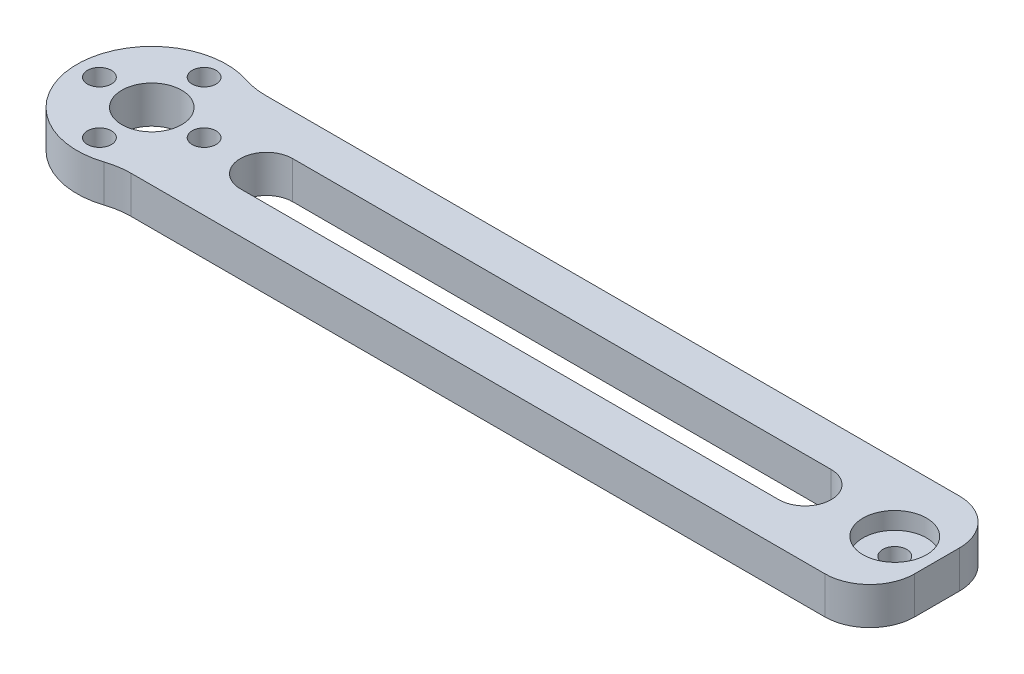
ISO-10303-21;
HEADER;
FILE_DESCRIPTION(('STEP AP214'),'2;1');
FILE_NAME('part.step','',(''),(''),'','','');
FILE_SCHEMA(('AUTOMOTIVE_DESIGN { 1 0 10303 214 1 1 1 1 }'));
ENDSEC;
DATA;
#1=APPLICATION_CONTEXT('core data for automotive mechanical design processes');
#2=APPLICATION_PROTOCOL_DEFINITION('international standard','automotive_design',2000,#1);
#3=PRODUCT_CONTEXT('',#1,'mechanical');
#4=PRODUCT('Part','Part','',(#3));
#5=PRODUCT_RELATED_PRODUCT_CATEGORY('part','',(#4));
#6=PRODUCT_DEFINITION_FORMATION('','',#4);
#7=PRODUCT_DEFINITION_CONTEXT('part definition',#1,'design');
#8=PRODUCT_DEFINITION('design','',#6,#7);
#9=PRODUCT_DEFINITION_SHAPE('','',#8);
#10=(LENGTH_UNIT() NAMED_UNIT(*) SI_UNIT(.MILLI.,.METRE.));
#11=(NAMED_UNIT(*) PLANE_ANGLE_UNIT() SI_UNIT($,.RADIAN.));
#12=(NAMED_UNIT(*) SI_UNIT($,.STERADIAN.) SOLID_ANGLE_UNIT());
#13=UNCERTAINTY_MEASURE_WITH_UNIT(LENGTH_MEASURE(1.E-05),#10,'distance_accuracy_value','');
#14=(GEOMETRIC_REPRESENTATION_CONTEXT(3) GLOBAL_UNCERTAINTY_ASSIGNED_CONTEXT((#13)) GLOBAL_UNIT_ASSIGNED_CONTEXT((#10,
#11,#12)) REPRESENTATION_CONTEXT('',''));
#15=CARTESIAN_POINT('',(0.,0.,0.));
#16=DIRECTION('',(0.,0.,1.));
#17=DIRECTION('',(1.,0.,0.));
#18=AXIS2_PLACEMENT_3D('',#15,#16,#17);
#19=CARTESIAN_POINT('',(99.34,5.,0.));
#20=DIRECTION('',(0.,-1.,0.));
#21=DIRECTION('',(0.,0.,-1.));
#22=AXIS2_PLACEMENT_3D('',#19,#20,#21);
#23=CYLINDRICAL_SURFACE('',#22,1.60000000000001);
#24=CARTESIAN_POINT('',(99.34,0.,0.));
#25=DIRECTION('',(0.,1.,0.));
#26=DIRECTION('',(0.,0.,1.));
#27=AXIS2_PLACEMENT_3D('',#24,#25,#26);
#28=CIRCLE('',#27,1.60000000000001);
#29=CARTESIAN_POINT('',(99.34,0.,1.6));
#30=VERTEX_POINT('',#29);
#31=EDGE_CURVE('E220',#30,#30,#28,.T.);
#32=ORIENTED_EDGE('',*,*,#31,.F.);
#33=EDGE_LOOP('',(#32));
#34=FACE_BOUND('',#33,.T.);
#35=CARTESIAN_POINT('',(99.34,2.7,0.));
#36=DIRECTION('',(0.,1.,0.));
#37=DIRECTION('',(0.,0.,1.));
#38=AXIS2_PLACEMENT_3D('',#35,#36,#37);
#39=CIRCLE('',#38,1.60000000000001);
#40=CARTESIAN_POINT('',(99.34,2.7,1.6));
#41=VERTEX_POINT('',#40);
#42=EDGE_CURVE('E197',#41,#41,#39,.T.);
#43=ORIENTED_EDGE('',*,*,#42,.T.);
#44=EDGE_LOOP('',(#43));
#45=FACE_BOUND('',#44,.T.);
#46=ADVANCED_FACE('F43',(#34,#45),#23,.F.);
#47=CARTESIAN_POINT('',(87.34,5.,0.));
#48=DIRECTION('',(0.,-1.,0.));
#49=DIRECTION('',(0.,0.,-1.));
#50=AXIS2_PLACEMENT_3D('',#47,#48,#49);
#51=CYLINDRICAL_SURFACE('',#50,3.5);
#52=CARTESIAN_POINT('',(87.34,0.,0.));
#53=DIRECTION('',(0.,1.,0.));
#54=DIRECTION('',(0.,0.,1.));
#55=AXIS2_PLACEMENT_3D('',#52,#53,#54);
#56=CIRCLE('',#55,3.5);
#57=CARTESIAN_POINT('',(87.34,0.,3.49999999999999));
#58=VERTEX_POINT('',#57);
#59=CARTESIAN_POINT('',(87.34,0.,-3.50000000000001));
#60=VERTEX_POINT('',#59);
#61=EDGE_CURVE('E208',#58,#60,#56,.T.);
#62=ORIENTED_EDGE('',*,*,#61,.F.);
#63=DIRECTION('',(0.,-1.,0.));
#64=VECTOR('',#63,1.);
#65=CARTESIAN_POINT('',(87.34,5.,3.49999999999999));
#66=LINE('',#65,#64);
#67=CARTESIAN_POINT('',(87.34,5.,3.49999999999999));
#68=VERTEX_POINT('',#67);
#69=EDGE_CURVE('E239',#68,#58,#66,.T.);
#70=ORIENTED_EDGE('',*,*,#69,.F.);
#71=CARTESIAN_POINT('',(87.34,5.,0.));
#72=DIRECTION('',(0.,1.,0.));
#73=DIRECTION('',(0.,0.,1.));
#74=AXIS2_PLACEMENT_3D('',#71,#72,#73);
#75=CIRCLE('',#74,3.5);
#76=CARTESIAN_POINT('',(87.34,5.,-3.50000000000001));
#77=VERTEX_POINT('',#76);
#78=EDGE_CURVE('E168',#68,#77,#75,.T.);
#79=ORIENTED_EDGE('',*,*,#78,.T.);
#80=DIRECTION('',(0.,-1.,0.));
#81=VECTOR('',#80,1.);
#82=CARTESIAN_POINT('',(87.34,5.,-3.50000000000001));
#83=LINE('',#82,#81);
#84=EDGE_CURVE('E145',#77,#60,#83,.T.);
#85=ORIENTED_EDGE('',*,*,#84,.T.);
#86=EDGE_LOOP('',(#62,#70,#79,#85));
#87=FACE_BOUND('',#86,.T.);
#88=ADVANCED_FACE('F331',(#87),#51,.F.);
#89=CARTESIAN_POINT('',(0.,5.,3.5));
#90=DIRECTION('',(0.,0.,-1.));
#91=DIRECTION('',(-1.,0.,0.));
#92=AXIS2_PLACEMENT_3D('',#89,#90,#91);
#93=PLANE('',#92);
#94=DIRECTION('',(1.,0.,0.));
#95=VECTOR('',#94,1.);
#96=CARTESIAN_POINT('',(0.,0.,3.5));
#97=LINE('',#96,#95);
#98=CARTESIAN_POINT('',(15.34,0.,3.5));
#99=VERTEX_POINT('',#98);
#100=EDGE_CURVE('E211',#99,#58,#97,.T.);
#101=ORIENTED_EDGE('',*,*,#100,.F.);
#102=DIRECTION('',(0.,-1.,0.));
#103=VECTOR('',#102,1.);
#104=CARTESIAN_POINT('',(15.34,5.,3.5));
#105=LINE('',#104,#103);
#106=CARTESIAN_POINT('',(15.34,5.,3.5));
#107=VERTEX_POINT('',#106);
#108=EDGE_CURVE('E237',#107,#99,#105,.T.);
#109=ORIENTED_EDGE('',*,*,#108,.F.);
#110=DIRECTION('',(1.,0.,0.));
#111=VECTOR('',#110,1.);
#112=CARTESIAN_POINT('',(0.,5.,3.5));
#113=LINE('',#112,#111);
#114=EDGE_CURVE('E171',#107,#68,#113,.T.);
#115=ORIENTED_EDGE('',*,*,#114,.T.);
#116=ORIENTED_EDGE('',*,*,#69,.T.);
#117=EDGE_LOOP('',(#101,#109,#115,#116));
#118=FACE_BOUND('',#117,.T.);
#119=ADVANCED_FACE('F338',(#118),#93,.T.);
#120=CARTESIAN_POINT('',(15.34,5.,0.));
#121=DIRECTION('',(0.,-1.,0.));
#122=DIRECTION('',(0.,0.,-1.));
#123=AXIS2_PLACEMENT_3D('',#120,#121,#122);
#124=CYLINDRICAL_SURFACE('',#123,3.5);
#125=CARTESIAN_POINT('',(15.34,0.,0.));
#126=DIRECTION('',(0.,1.,0.));
#127=DIRECTION('',(0.,0.,1.));
#128=AXIS2_PLACEMENT_3D('',#125,#126,#127);
#129=CIRCLE('',#128,3.5);
#130=CARTESIAN_POINT('',(15.34,0.,-3.5));
#131=VERTEX_POINT('',#130);
#132=EDGE_CURVE('E214',#131,#99,#129,.T.);
#133=ORIENTED_EDGE('',*,*,#132,.F.);
#134=DIRECTION('',(0.,-1.,0.));
#135=VECTOR('',#134,1.);
#136=CARTESIAN_POINT('',(15.34,5.,-3.5));
#137=LINE('',#136,#135);
#138=CARTESIAN_POINT('',(15.34,5.,-3.5));
#139=VERTEX_POINT('',#138);
#140=EDGE_CURVE('E235',#139,#131,#137,.T.);
#141=ORIENTED_EDGE('',*,*,#140,.F.);
#142=CARTESIAN_POINT('',(15.34,5.,0.));
#143=DIRECTION('',(0.,1.,0.));
#144=DIRECTION('',(0.,0.,1.));
#145=AXIS2_PLACEMENT_3D('',#142,#143,#144);
#146=CIRCLE('',#145,3.5);
#147=EDGE_CURVE('E174',#139,#107,#146,.T.);
#148=ORIENTED_EDGE('',*,*,#147,.T.);
#149=ORIENTED_EDGE('',*,*,#108,.T.);
#150=EDGE_LOOP('',(#133,#141,#148,#149));
#151=FACE_BOUND('',#150,.T.);
#152=ADVANCED_FACE('F348',(#151),#124,.F.);
#153=CARTESIAN_POINT('',(99.,5.,-2.99999999999999));
#154=DIRECTION('',(0.,-1.,0.));
#155=DIRECTION('',(0.,0.,-1.));
#156=AXIS2_PLACEMENT_3D('',#153,#154,#155);
#157=CYLINDRICAL_SURFACE('',#156,6.00000000000001);
#158=CARTESIAN_POINT('',(99.,0.,-2.99999999999999));
#159=DIRECTION('',(0.,1.,0.));
#160=DIRECTION('',(0.,0.,1.));
#161=AXIS2_PLACEMENT_3D('',#158,#159,#160);
#162=CIRCLE('',#161,6.00000000000001);
#163=CARTESIAN_POINT('',(99.,0.,-8.99999999999999));
#164=VERTEX_POINT('',#163);
#165=CARTESIAN_POINT('',(105.,0.,-2.99999999999999));
#166=VERTEX_POINT('',#165);
#167=EDGE_CURVE('E144',#164,#166,#162,.F.);
#168=ORIENTED_EDGE('',*,*,#167,.F.);
#169=DIRECTION('',(0.,-1.,0.));
#170=VECTOR('',#169,1.);
#171=CARTESIAN_POINT('',(99.,5.,-8.99999999999999));
#172=LINE('',#171,#170);
#173=CARTESIAN_POINT('',(99.,5.,-8.99999999999999));
#174=VERTEX_POINT('',#173);
#175=EDGE_CURVE('E131',#174,#164,#172,.T.);
#176=ORIENTED_EDGE('',*,*,#175,.F.);
#177=CARTESIAN_POINT('',(99.,5.,-2.99999999999999));
#178=DIRECTION('',(0.,1.,0.));
#179=DIRECTION('',(0.,0.,1.));
#180=AXIS2_PLACEMENT_3D('',#177,#178,#179);
#181=CIRCLE('',#180,6.00000000000001);
#182=CARTESIAN_POINT('',(105.,5.,-2.99999999999999));
#183=VERTEX_POINT('',#182);
#184=EDGE_CURVE('E137',#174,#183,#181,.F.);
#185=ORIENTED_EDGE('',*,*,#184,.T.);
#186=DIRECTION('',(0.,-1.,0.));
#187=VECTOR('',#186,1.);
#188=CARTESIAN_POINT('',(105.,5.,-2.99999999999999));
#189=LINE('',#188,#187);
#190=EDGE_CURVE('E194',#183,#166,#189,.T.);
#191=ORIENTED_EDGE('',*,*,#190,.T.);
#192=EDGE_LOOP('',(#168,#176,#185,#191));
#193=FACE_BOUND('',#192,.T.);
#194=ADVANCED_FACE('F141',(#193),#157,.T.);
#195=CARTESIAN_POINT('',(0.,5.,-8.99999999999999));
#196=DIRECTION('',(0.,0.,-1.));
#197=DIRECTION('',(-1.,0.,0.));
#198=AXIS2_PLACEMENT_3D('',#195,#196,#197);
#199=PLANE('',#198);
#200=DIRECTION('',(1.,0.,0.));
#201=VECTOR('',#200,1.);
#202=CARTESIAN_POINT('',(0.,0.,-8.99999999999999));
#203=LINE('',#202,#201);
#204=CARTESIAN_POINT('',(6.24499799839843,0.,-8.99999999999999));
#205=VERTEX_POINT('',#204);
#206=EDGE_CURVE('E196',#205,#164,#203,.T.);
#207=ORIENTED_EDGE('',*,*,#206,.F.);
#208=DIRECTION('',(0.,-1.,0.));
#209=VECTOR('',#208,1.);
#210=CARTESIAN_POINT('',(6.24499799839843,5.,-8.99999999999999));
#211=LINE('',#210,#209);
#212=CARTESIAN_POINT('',(6.24499799839843,5.,-8.99999999999999));
#213=VERTEX_POINT('',#212);
#214=EDGE_CURVE('E64',#205,#213,#211,.F.);
#215=ORIENTED_EDGE('',*,*,#214,.T.);
#216=DIRECTION('',(1.,0.,0.));
#217=VECTOR('',#216,1.);
#218=CARTESIAN_POINT('',(0.,5.,-8.99999999999999));
#219=LINE('',#218,#217);
#220=EDGE_CURVE('E128',#213,#174,#219,.T.);
#221=ORIENTED_EDGE('',*,*,#220,.T.);
#222=ORIENTED_EDGE('',*,*,#175,.T.);
#223=EDGE_LOOP('',(#207,#215,#221,#222));
#224=FACE_BOUND('',#223,.T.);
#225=ADVANCED_FACE('F130',(#224),#199,.T.);
#226=CARTESIAN_POINT('',(0.,5.,8.99999999999999));
#227=DIRECTION('',(0.,0.,1.));
#228=DIRECTION('',(1.,0.,0.));
#229=AXIS2_PLACEMENT_3D('',#226,#227,#228);
#230=PLANE('',#229);
#231=DIRECTION('',(-1.,0.,0.));
#232=VECTOR('',#231,1.);
#233=CARTESIAN_POINT('',(0.,5.,8.99999999999999));
#234=LINE('',#233,#232);
#235=CARTESIAN_POINT('',(99.,5.,8.99999999999999));
#236=VERTEX_POINT('',#235);
#237=CARTESIAN_POINT('',(6.24499799839843,5.,8.99999999999999));
#238=VERTEX_POINT('',#237);
#239=EDGE_CURVE('E136',#236,#238,#234,.T.);
#240=ORIENTED_EDGE('',*,*,#239,.T.);
#241=DIRECTION('',(0.,-1.,0.));
#242=VECTOR('',#241,1.);
#243=CARTESIAN_POINT('',(6.24499799839843,0.,8.99999999999999));
#244=LINE('',#243,#242);
#245=CARTESIAN_POINT('',(6.24499799839843,0.,8.99999999999999));
#246=VERTEX_POINT('',#245);
#247=EDGE_CURVE('E254',#238,#246,#244,.T.);
#248=ORIENTED_EDGE('',*,*,#247,.T.);
#249=DIRECTION('',(-1.,0.,0.));
#250=VECTOR('',#249,1.);
#251=CARTESIAN_POINT('',(0.,0.,8.99999999999999));
#252=LINE('',#251,#250);
#253=CARTESIAN_POINT('',(99.,0.,8.99999999999999));
#254=VERTEX_POINT('',#253);
#255=EDGE_CURVE('E199',#254,#246,#252,.T.);
#256=ORIENTED_EDGE('',*,*,#255,.F.);
#257=DIRECTION('',(0.,-1.,0.));
#258=VECTOR('',#257,1.);
#259=CARTESIAN_POINT('',(99.,5.,8.99999999999999));
#260=LINE('',#259,#258);
#261=EDGE_CURVE('E146',#236,#254,#260,.T.);
#262=ORIENTED_EDGE('',*,*,#261,.F.);
#263=EDGE_LOOP('',(#240,#248,#256,#262));
#264=FACE_BOUND('',#263,.T.);
#265=ADVANCED_FACE('F279',(#264),#230,.T.);
#266=CARTESIAN_POINT('',(99.,5.,2.99999999999999));
#267=DIRECTION('',(0.,-1.,0.));
#268=DIRECTION('',(0.,0.,-1.));
#269=AXIS2_PLACEMENT_3D('',#266,#267,#268);
#270=CYLINDRICAL_SURFACE('',#269,6.00000000000001);
#271=CARTESIAN_POINT('',(99.,0.,2.99999999999999));
#272=DIRECTION('',(0.,1.,0.));
#273=DIRECTION('',(0.,0.,1.));
#274=AXIS2_PLACEMENT_3D('',#271,#272,#273);
#275=CIRCLE('',#274,6.00000000000001);
#276=CARTESIAN_POINT('',(105.,0.,2.99999999999999));
#277=VERTEX_POINT('',#276);
#278=EDGE_CURVE('E202',#277,#254,#275,.F.);
#279=ORIENTED_EDGE('',*,*,#278,.F.);
#280=DIRECTION('',(0.,-1.,0.));
#281=VECTOR('',#280,1.);
#282=CARTESIAN_POINT('',(105.,5.,2.99999999999999));
#283=LINE('',#282,#281);
#284=CARTESIAN_POINT('',(105.,5.,2.99999999999999));
#285=VERTEX_POINT('',#284);
#286=EDGE_CURVE('E243',#285,#277,#283,.T.);
#287=ORIENTED_EDGE('',*,*,#286,.F.);
#288=CARTESIAN_POINT('',(99.,5.,2.99999999999999));
#289=DIRECTION('',(0.,1.,0.));
#290=DIRECTION('',(0.,0.,1.));
#291=AXIS2_PLACEMENT_3D('',#288,#289,#290);
#292=CIRCLE('',#291,6.00000000000001);
#293=EDGE_CURVE('E164',#285,#236,#292,.F.);
#294=ORIENTED_EDGE('',*,*,#293,.T.);
#295=ORIENTED_EDGE('',*,*,#261,.T.);
#296=EDGE_LOOP('',(#279,#287,#294,#295));
#297=FACE_BOUND('',#296,.T.);
#298=ADVANCED_FACE('F282',(#297),#270,.T.);
#299=CARTESIAN_POINT('',(-7.,5.,0.));
#300=DIRECTION('',(0.,-1.,0.));
#301=DIRECTION('',(0.,0.,-1.));
#302=AXIS2_PLACEMENT_3D('',#299,#300,#301);
#303=CYLINDRICAL_SURFACE('',#302,1.6);
#304=CARTESIAN_POINT('',(-7.,5.,0.));
#305=DIRECTION('',(0.,1.,0.));
#306=DIRECTION('',(0.,0.,1.));
#307=AXIS2_PLACEMENT_3D('',#304,#305,#306);
#308=CIRCLE('',#307,1.6);
#309=CARTESIAN_POINT('',(-7.,5.,1.6));
#310=VERTEX_POINT('',#309);
#311=EDGE_CURVE('E188',#310,#310,#308,.T.);
#312=ORIENTED_EDGE('',*,*,#311,.T.);
#313=EDGE_LOOP('',(#312));
#314=FACE_BOUND('',#313,.T.);
#315=CARTESIAN_POINT('',(-7.,0.,0.));
#316=DIRECTION('',(0.,1.,0.));
#317=DIRECTION('',(0.,0.,1.));
#318=AXIS2_PLACEMENT_3D('',#315,#316,#317);
#319=CIRCLE('',#318,1.6);
#320=CARTESIAN_POINT('',(-7.,0.,1.6));
#321=VERTEX_POINT('',#320);
#322=EDGE_CURVE('E156',#321,#321,#319,.T.);
#323=ORIENTED_EDGE('',*,*,#322,.F.);
#324=EDGE_LOOP('',(#323));
#325=FACE_BOUND('',#324,.T.);
#326=ADVANCED_FACE('F359',(#314,#325),#303,.F.);
#327=CARTESIAN_POINT('',(0.,5.,-7.));
#328=DIRECTION('',(0.,-1.,0.));
#329=DIRECTION('',(0.,0.,-1.));
#330=AXIS2_PLACEMENT_3D('',#327,#328,#329);
#331=CYLINDRICAL_SURFACE('',#330,1.6);
#332=CARTESIAN_POINT('',(0.,5.,-7.));
#333=DIRECTION('',(0.,1.,0.));
#334=DIRECTION('',(0.,0.,1.));
#335=AXIS2_PLACEMENT_3D('',#332,#333,#334);
#336=CIRCLE('',#335,1.6);
#337=CARTESIAN_POINT('',(0.,5.,-5.4));
#338=VERTEX_POINT('',#337);
#339=EDGE_CURVE('E185',#338,#338,#336,.T.);
#340=ORIENTED_EDGE('',*,*,#339,.T.);
#341=EDGE_LOOP('',(#340));
#342=FACE_BOUND('',#341,.T.);
#343=CARTESIAN_POINT('',(0.,0.,-7.));
#344=DIRECTION('',(0.,1.,0.));
#345=DIRECTION('',(0.,0.,1.));
#346=AXIS2_PLACEMENT_3D('',#343,#344,#345);
#347=CIRCLE('',#346,1.6);
#348=CARTESIAN_POINT('',(0.,0.,-5.4));
#349=VERTEX_POINT('',#348);
#350=EDGE_CURVE('E229',#349,#349,#347,.T.);
#351=ORIENTED_EDGE('',*,*,#350,.F.);
#352=EDGE_LOOP('',(#351));
#353=FACE_BOUND('',#352,.T.);
#354=ADVANCED_FACE('F466',(#342,#353),#331,.F.);
#355=CARTESIAN_POINT('',(7.,5.,0.));
#356=DIRECTION('',(0.,-1.,0.));
#357=DIRECTION('',(0.,0.,-1.));
#358=AXIS2_PLACEMENT_3D('',#355,#356,#357);
#359=CYLINDRICAL_SURFACE('',#358,1.6);
#360=CARTESIAN_POINT('',(7.,5.,0.));
#361=DIRECTION('',(0.,1.,0.));
#362=DIRECTION('',(0.,0.,1.));
#363=AXIS2_PLACEMENT_3D('',#360,#361,#362);
#364=CIRCLE('',#363,1.6);
#365=CARTESIAN_POINT('',(7.,5.,1.6));
#366=VERTEX_POINT('',#365);
#367=EDGE_CURVE('E182',#366,#366,#364,.T.);
#368=ORIENTED_EDGE('',*,*,#367,.T.);
#369=EDGE_LOOP('',(#368));
#370=FACE_BOUND('',#369,.T.);
#371=CARTESIAN_POINT('',(7.,0.,0.));
#372=DIRECTION('',(0.,1.,0.));
#373=DIRECTION('',(0.,0.,1.));
#374=AXIS2_PLACEMENT_3D('',#371,#372,#373);
#375=CIRCLE('',#374,1.6);
#376=CARTESIAN_POINT('',(7.,0.,1.6));
#377=VERTEX_POINT('',#376);
#378=EDGE_CURVE('E226',#377,#377,#375,.T.);
#379=ORIENTED_EDGE('',*,*,#378,.F.);
#380=EDGE_LOOP('',(#379));
#381=FACE_BOUND('',#380,.T.);
#382=ADVANCED_FACE('F316',(#370,#381),#359,.F.);
#383=CARTESIAN_POINT('',(0.,5.,7.));
#384=DIRECTION('',(0.,-1.,0.));
#385=DIRECTION('',(0.,0.,-1.));
#386=AXIS2_PLACEMENT_3D('',#383,#384,#385);
#387=CYLINDRICAL_SURFACE('',#386,1.6);
#388=CARTESIAN_POINT('',(0.,5.,7.));
#389=DIRECTION('',(0.,1.,0.));
#390=DIRECTION('',(0.,0.,1.));
#391=AXIS2_PLACEMENT_3D('',#388,#389,#390);
#392=CIRCLE('',#391,1.6);
#393=CARTESIAN_POINT('',(0.,5.,8.6));
#394=VERTEX_POINT('',#393);
#395=EDGE_CURVE('E179',#394,#394,#392,.T.);
#396=ORIENTED_EDGE('',*,*,#395,.T.);
#397=EDGE_LOOP('',(#396));
#398=FACE_BOUND('',#397,.T.);
#399=CARTESIAN_POINT('',(0.,0.,7.));
#400=DIRECTION('',(0.,1.,0.));
#401=DIRECTION('',(0.,0.,1.));
#402=AXIS2_PLACEMENT_3D('',#399,#400,#401);
#403=CIRCLE('',#402,1.6);
#404=CARTESIAN_POINT('',(0.,0.,8.6));
#405=VERTEX_POINT('',#404);
#406=EDGE_CURVE('E223',#405,#405,#403,.T.);
#407=ORIENTED_EDGE('',*,*,#406,.F.);
#408=EDGE_LOOP('',(#407));
#409=FACE_BOUND('',#408,.T.);
#410=ADVANCED_FACE('F312',(#398,#409),#387,.F.);
#411=CARTESIAN_POINT('',(0.,5.,-3.5));
#412=DIRECTION('',(0.,0.,-1.));
#413=DIRECTION('',(-1.,0.,0.));
#414=AXIS2_PLACEMENT_3D('',#411,#412,#413);
#415=PLANE('',#414);
#416=DIRECTION('',(1.,0.,0.));
#417=VECTOR('',#416,1.);
#418=CARTESIAN_POINT('',(0.,0.,-3.5));
#419=LINE('',#418,#417);
#420=EDGE_CURVE('E217',#131,#60,#419,.T.);
#421=ORIENTED_EDGE('',*,*,#420,.T.);
#422=ORIENTED_EDGE('',*,*,#84,.F.);
#423=DIRECTION('',(1.,0.,0.));
#424=VECTOR('',#423,1.);
#425=CARTESIAN_POINT('',(0.,5.,-3.5));
#426=LINE('',#425,#424);
#427=EDGE_CURVE('E177',#139,#77,#426,.T.);
#428=ORIENTED_EDGE('',*,*,#427,.F.);
#429=ORIENTED_EDGE('',*,*,#140,.T.);
#430=EDGE_LOOP('',(#421,#422,#428,#429));
#431=FACE_BOUND('',#430,.T.);
#432=ADVANCED_FACE('F315',(#431),#415,.F.);
#433=CARTESIAN_POINT('',(105.,5.,0.));
#434=DIRECTION('',(1.,0.,0.));
#435=DIRECTION('',(0.,0.,-1.));
#436=AXIS2_PLACEMENT_3D('',#433,#434,#435);
#437=PLANE('',#436);
#438=DIRECTION('',(0.,0.,1.));
#439=VECTOR('',#438,1.);
#440=CARTESIAN_POINT('',(105.,0.,0.));
#441=LINE('',#440,#439);
#442=EDGE_CURVE('E205',#166,#277,#441,.T.);
#443=ORIENTED_EDGE('',*,*,#442,.F.);
#444=ORIENTED_EDGE('',*,*,#190,.F.);
#445=DIRECTION('',(0.,0.,1.));
#446=VECTOR('',#445,1.);
#447=CARTESIAN_POINT('',(105.,5.,0.));
#448=LINE('',#447,#446);
#449=EDGE_CURVE('E152',#183,#285,#448,.T.);
#450=ORIENTED_EDGE('',*,*,#449,.T.);
#451=ORIENTED_EDGE('',*,*,#286,.T.);
#452=EDGE_LOOP('',(#443,#444,#450,#451));
#453=FACE_BOUND('',#452,.T.);
#454=ADVANCED_FACE('F285',(#453),#437,.T.);
#455=CARTESIAN_POINT('',(0.,5.,0.));
#456=DIRECTION('',(0.,-1.,0.));
#457=DIRECTION('',(0.,0.,-1.));
#458=AXIS2_PLACEMENT_3D('',#455,#456,#457);
#459=CYLINDRICAL_SURFACE('',#458,4.);
#460=CARTESIAN_POINT('',(0.,5.,0.));
#461=DIRECTION('',(0.,1.,0.));
#462=DIRECTION('',(0.,0.,1.));
#463=AXIS2_PLACEMENT_3D('',#460,#461,#462);
#464=CIRCLE('',#463,4.);
#465=CARTESIAN_POINT('',(0.,5.,4.));
#466=VERTEX_POINT('',#465);
#467=EDGE_CURVE('E191',#466,#466,#464,.T.);
#468=ORIENTED_EDGE('',*,*,#467,.T.);
#469=EDGE_LOOP('',(#468));
#470=FACE_BOUND('',#469,.T.);
#471=CARTESIAN_POINT('',(0.,0.,0.));
#472=DIRECTION('',(0.,1.,0.));
#473=DIRECTION('',(0.,0.,1.));
#474=AXIS2_PLACEMENT_3D('',#471,#472,#473);
#475=CIRCLE('',#474,4.);
#476=CARTESIAN_POINT('',(0.,0.,4.));
#477=VERTEX_POINT('',#476);
#478=EDGE_CURVE('E153',#477,#477,#475,.T.);
#479=ORIENTED_EDGE('',*,*,#478,.F.);
#480=EDGE_LOOP('',(#479));
#481=FACE_BOUND('',#480,.T.);
#482=ADVANCED_FACE('F297',(#470,#481),#459,.F.);
#483=CARTESIAN_POINT('',(0.,5.,0.));
#484=DIRECTION('',(0.,1.,0.));
#485=DIRECTION('',(0.,0.,1.));
#486=AXIS2_PLACEMENT_3D('',#483,#484,#485);
#487=PLANE('',#486);
#488=ORIENTED_EDGE('',*,*,#220,.F.);
#489=CARTESIAN_POINT('',(6.24499799839843,5.,-19.));
#490=DIRECTION('',(0.,1.,0.));
#491=DIRECTION('',(0.,0.,1.));
#492=AXIS2_PLACEMENT_3D('',#489,#490,#491);
#493=CIRCLE('',#492,10.);
#494=CARTESIAN_POINT('',(3.12249899919922,5.,-9.49999999999999));
#495=VERTEX_POINT('',#494);
#496=EDGE_CURVE('E11',#213,#495,#493,.F.);
#497=ORIENTED_EDGE('',*,*,#496,.T.);
#498=CARTESIAN_POINT('',(0.,5.,0.));
#499=DIRECTION('',(0.,1.,0.));
#500=DIRECTION('',(0.,0.,1.));
#501=AXIS2_PLACEMENT_3D('',#498,#499,#500);
#502=CIRCLE('',#501,10.);
#503=CARTESIAN_POINT('',(3.12249899919922,5.,9.49999999999999));
#504=VERTEX_POINT('',#503);
#505=EDGE_CURVE('E274',#495,#504,#502,.T.);
#506=ORIENTED_EDGE('',*,*,#505,.T.);
#507=CARTESIAN_POINT('',(6.24499799839843,5.,19.));
#508=DIRECTION('',(0.,1.,0.));
#509=DIRECTION('',(0.,0.,1.));
#510=AXIS2_PLACEMENT_3D('',#507,#508,#509);
#511=CIRCLE('',#510,10.);
#512=EDGE_CURVE('E257',#504,#238,#511,.F.);
#513=ORIENTED_EDGE('',*,*,#512,.T.);
#514=ORIENTED_EDGE('',*,*,#239,.F.);
#515=ORIENTED_EDGE('',*,*,#293,.F.);
#516=ORIENTED_EDGE('',*,*,#449,.F.);
#517=ORIENTED_EDGE('',*,*,#184,.F.);
#518=EDGE_LOOP('',(#488,#497,#506,#513,#514,#515,#516,#517));
#519=FACE_BOUND('',#518,.T.);
#520=CARTESIAN_POINT('',(99.34,5.,0.));
#521=DIRECTION('',(0.,1.,0.));
#522=DIRECTION('',(0.,0.,1.));
#523=AXIS2_PLACEMENT_3D('',#520,#521,#522);
#524=CIRCLE('',#523,4.25000000000001);
#525=CARTESIAN_POINT('',(99.34,5.,4.25));
#526=VERTEX_POINT('',#525);
#527=EDGE_CURVE('E159',#526,#526,#524,.T.);
#528=ORIENTED_EDGE('',*,*,#527,.F.);
#529=EDGE_LOOP('',(#528));
#530=FACE_BOUND('',#529,.T.);
#531=ORIENTED_EDGE('',*,*,#78,.F.);
#532=ORIENTED_EDGE('',*,*,#114,.F.);
#533=ORIENTED_EDGE('',*,*,#147,.F.);
#534=ORIENTED_EDGE('',*,*,#427,.T.);
#535=EDGE_LOOP('',(#531,#532,#533,#534));
#536=FACE_BOUND('',#535,.T.);
#537=ORIENTED_EDGE('',*,*,#467,.F.);
#538=EDGE_LOOP('',(#537));
#539=FACE_BOUND('',#538,.T.);
#540=ORIENTED_EDGE('',*,*,#311,.F.);
#541=EDGE_LOOP('',(#540));
#542=FACE_BOUND('',#541,.T.);
#543=ORIENTED_EDGE('',*,*,#339,.F.);
#544=EDGE_LOOP('',(#543));
#545=FACE_BOUND('',#544,.T.);
#546=ORIENTED_EDGE('',*,*,#367,.F.);
#547=EDGE_LOOP('',(#546));
#548=FACE_BOUND('',#547,.T.);
#549=ORIENTED_EDGE('',*,*,#395,.F.);
#550=EDGE_LOOP('',(#549));
#551=FACE_BOUND('',#550,.T.);
#552=ADVANCED_FACE('F148',(#519,#530,#536,#539,#542,#545,#548,#551),#487,.T.);
#553=CARTESIAN_POINT('',(0.,0.,0.));
#554=DIRECTION('',(0.,1.,0.));
#555=DIRECTION('',(0.,0.,1.));
#556=AXIS2_PLACEMENT_3D('',#553,#554,#555);
#557=PLANE('',#556);
#558=CARTESIAN_POINT('',(0.,0.,0.));
#559=DIRECTION('',(0.,1.,0.));
#560=DIRECTION('',(0.,0.,1.));
#561=AXIS2_PLACEMENT_3D('',#558,#559,#560);
#562=CIRCLE('',#561,10.);
#563=CARTESIAN_POINT('',(3.12249899919922,0.,-9.49999999999999));
#564=VERTEX_POINT('',#563);
#565=CARTESIAN_POINT('',(3.12249899919922,0.,9.49999999999999));
#566=VERTEX_POINT('',#565);
#567=EDGE_CURVE('E264',#564,#566,#562,.T.);
#568=ORIENTED_EDGE('',*,*,#567,.F.);
#569=CARTESIAN_POINT('',(6.24499799839843,0.,-19.));
#570=DIRECTION('',(0.,1.,0.));
#571=DIRECTION('',(0.,0.,1.));
#572=AXIS2_PLACEMENT_3D('',#569,#570,#571);
#573=CIRCLE('',#572,10.);
#574=EDGE_CURVE('E51',#564,#205,#573,.T.);
#575=ORIENTED_EDGE('',*,*,#574,.T.);
#576=ORIENTED_EDGE('',*,*,#206,.T.);
#577=ORIENTED_EDGE('',*,*,#167,.T.);
#578=ORIENTED_EDGE('',*,*,#442,.T.);
#579=ORIENTED_EDGE('',*,*,#278,.T.);
#580=ORIENTED_EDGE('',*,*,#255,.T.);
#581=CARTESIAN_POINT('',(6.24499799839843,0.,19.));
#582=DIRECTION('',(0.,1.,0.));
#583=DIRECTION('',(0.,0.,1.));
#584=AXIS2_PLACEMENT_3D('',#581,#582,#583);
#585=CIRCLE('',#584,10.);
#586=EDGE_CURVE('E259',#246,#566,#585,.T.);
#587=ORIENTED_EDGE('',*,*,#586,.T.);
#588=EDGE_LOOP('',(#568,#575,#576,#577,#578,#579,#580,#587));
#589=FACE_BOUND('',#588,.T.);
#590=ORIENTED_EDGE('',*,*,#61,.T.);
#591=ORIENTED_EDGE('',*,*,#420,.F.);
#592=ORIENTED_EDGE('',*,*,#132,.T.);
#593=ORIENTED_EDGE('',*,*,#100,.T.);
#594=EDGE_LOOP('',(#590,#591,#592,#593));
#595=FACE_BOUND('',#594,.T.);
#596=ORIENTED_EDGE('',*,*,#31,.T.);
#597=EDGE_LOOP('',(#596));
#598=FACE_BOUND('',#597,.T.);
#599=ORIENTED_EDGE('',*,*,#478,.T.);
#600=EDGE_LOOP('',(#599));
#601=FACE_BOUND('',#600,.T.);
#602=ORIENTED_EDGE('',*,*,#322,.T.);
#603=EDGE_LOOP('',(#602));
#604=FACE_BOUND('',#603,.T.);
#605=ORIENTED_EDGE('',*,*,#350,.T.);
#606=EDGE_LOOP('',(#605));
#607=FACE_BOUND('',#606,.T.);
#608=ORIENTED_EDGE('',*,*,#378,.T.);
#609=EDGE_LOOP('',(#608));
#610=FACE_BOUND('',#609,.T.);
#611=ORIENTED_EDGE('',*,*,#406,.T.);
#612=EDGE_LOOP('',(#611));
#613=FACE_BOUND('',#612,.T.);
#614=ADVANCED_FACE('F262',(#589,#595,#598,#601,#604,#607,#610,#613),#557,.F.);
#615=CARTESIAN_POINT('',(99.34,2.7,0.));
#616=DIRECTION('',(0.,1.,0.));
#617=DIRECTION('',(0.,0.,1.));
#618=AXIS2_PLACEMENT_3D('',#615,#616,#617);
#619=CYLINDRICAL_SURFACE('',#618,4.25000000000001);
#620=CARTESIAN_POINT('',(99.34,2.7,0.));
#621=DIRECTION('',(0.,1.,0.));
#622=DIRECTION('',(0.,0.,1.));
#623=AXIS2_PLACEMENT_3D('',#620,#621,#622);
#624=CIRCLE('',#623,4.25000000000001);
#625=CARTESIAN_POINT('',(99.34,2.7,4.25));
#626=VERTEX_POINT('',#625);
#627=EDGE_CURVE('E248',#626,#626,#624,.T.);
#628=ORIENTED_EDGE('',*,*,#627,.F.);
#629=EDGE_LOOP('',(#628));
#630=FACE_BOUND('',#629,.T.);
#631=ORIENTED_EDGE('',*,*,#527,.T.);
#632=EDGE_LOOP('',(#631));
#633=FACE_BOUND('',#632,.T.);
#634=ADVANCED_FACE('F294',(#630,#633),#619,.F.);
#635=CARTESIAN_POINT('',(99.34,2.7,0.));
#636=DIRECTION('',(0.,1.,0.));
#637=DIRECTION('',(0.,0.,1.));
#638=AXIS2_PLACEMENT_3D('',#635,#636,#637);
#639=PLANE('',#638);
#640=ORIENTED_EDGE('',*,*,#42,.F.);
#641=EDGE_LOOP('',(#640));
#642=FACE_BOUND('',#641,.T.);
#643=ORIENTED_EDGE('',*,*,#627,.T.);
#644=EDGE_LOOP('',(#643));
#645=FACE_BOUND('',#644,.T.);
#646=ADVANCED_FACE('F326',(#642,#645),#639,.T.);
#647=CARTESIAN_POINT('',(0.,0.,0.));
#648=DIRECTION('',(0.,1.,0.));
#649=DIRECTION('',(0.,0.,1.));
#650=AXIS2_PLACEMENT_3D('',#647,#648,#649);
#651=CYLINDRICAL_SURFACE('',#650,10.);
#652=ORIENTED_EDGE('',*,*,#567,.T.);
#653=DIRECTION('',(0.,1.,0.));
#654=VECTOR('',#653,1.);
#655=CARTESIAN_POINT('',(3.12249899919922,0.,9.49999999999999));
#656=LINE('',#655,#654);
#657=EDGE_CURVE('E251',#566,#504,#656,.T.);
#658=ORIENTED_EDGE('',*,*,#657,.T.);
#659=ORIENTED_EDGE('',*,*,#505,.F.);
#660=DIRECTION('',(0.,1.,0.));
#661=VECTOR('',#660,1.);
#662=CARTESIAN_POINT('',(3.12249899919922,0.,-9.49999999999999));
#663=LINE('',#662,#661);
#664=EDGE_CURVE('E241',#495,#564,#663,.F.);
#665=ORIENTED_EDGE('',*,*,#664,.T.);
#666=EDGE_LOOP('',(#652,#658,#659,#665));
#667=FACE_BOUND('',#666,.T.);
#668=ADVANCED_FACE('F270',(#667),#651,.T.);
#669=CARTESIAN_POINT('',(6.24499799839843,0.,19.));
#670=DIRECTION('',(0.,1.,0.));
#671=DIRECTION('',(0.,0.,1.));
#672=AXIS2_PLACEMENT_3D('',#669,#670,#671);
#673=CYLINDRICAL_SURFACE('',#672,10.);
#674=ORIENTED_EDGE('',*,*,#586,.F.);
#675=ORIENTED_EDGE('',*,*,#247,.F.);
#676=ORIENTED_EDGE('',*,*,#512,.F.);
#677=ORIENTED_EDGE('',*,*,#657,.F.);
#678=EDGE_LOOP('',(#674,#675,#676,#677));
#679=FACE_BOUND('',#678,.T.);
#680=ADVANCED_FACE('F276',(#679),#673,.F.);
#681=CARTESIAN_POINT('',(6.24499799839843,0.,-19.));
#682=DIRECTION('',(0.,1.,0.));
#683=DIRECTION('',(0.,0.,1.));
#684=AXIS2_PLACEMENT_3D('',#681,#682,#683);
#685=CYLINDRICAL_SURFACE('',#684,10.);
#686=ORIENTED_EDGE('',*,*,#496,.F.);
#687=ORIENTED_EDGE('',*,*,#214,.F.);
#688=ORIENTED_EDGE('',*,*,#574,.F.);
#689=ORIENTED_EDGE('',*,*,#664,.F.);
#690=EDGE_LOOP('',(#686,#687,#688,#689));
#691=FACE_BOUND('',#690,.T.);
#692=ADVANCED_FACE('F45',(#691),#685,.F.);
#693=CLOSED_SHELL('',(#46,#88,#119,#152,#194,#225,#265,#298,#326,#354,#382,#410,#432,#454,#482,
#552,#614,#634,#646,#668,#680,#692));
#694=MANIFOLD_SOLID_BREP('B2',#693);
#695=ADVANCED_BREP_SHAPE_REPRESENTATION('',(#18,#694),#14);
#696=SHAPE_DEFINITION_REPRESENTATION(#9,#695);
ENDSEC;
END-ISO-10303-21;
